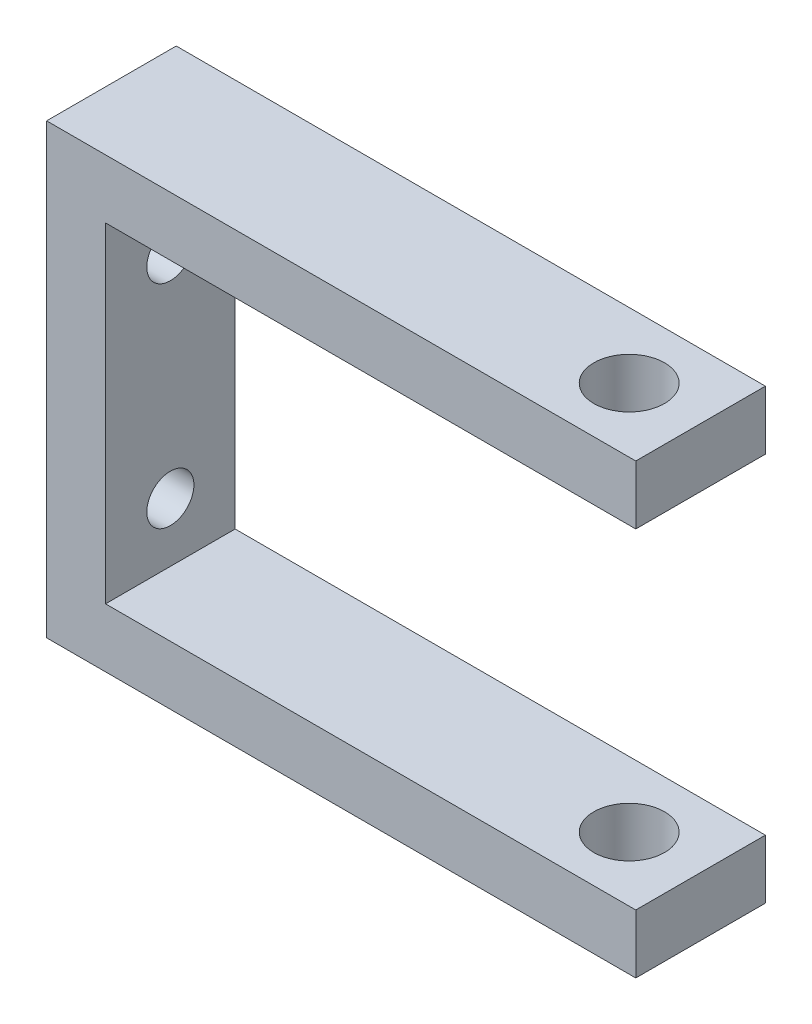
ISO-10303-21;
HEADER;
FILE_DESCRIPTION(('STEP AP214'),'2;1');
FILE_NAME('part.step','',(''),(''),'','','');
FILE_SCHEMA(('AUTOMOTIVE_DESIGN { 1 0 10303 214 1 1 1 1 }'));
ENDSEC;
DATA;
#1=APPLICATION_CONTEXT('core data for automotive mechanical design processes');
#2=APPLICATION_PROTOCOL_DEFINITION('international standard','automotive_design',2000,#1);
#3=PRODUCT_CONTEXT('',#1,'mechanical');
#4=PRODUCT('Part','Part','',(#3));
#5=PRODUCT_RELATED_PRODUCT_CATEGORY('part','',(#4));
#6=PRODUCT_DEFINITION_FORMATION('','',#4);
#7=PRODUCT_DEFINITION_CONTEXT('part definition',#1,'design');
#8=PRODUCT_DEFINITION('design','',#6,#7);
#9=PRODUCT_DEFINITION_SHAPE('','',#8);
#10=(LENGTH_UNIT() NAMED_UNIT(*) SI_UNIT(.MILLI.,.METRE.));
#11=(NAMED_UNIT(*) PLANE_ANGLE_UNIT() SI_UNIT($,.RADIAN.));
#12=(NAMED_UNIT(*) SI_UNIT($,.STERADIAN.) SOLID_ANGLE_UNIT());
#13=UNCERTAINTY_MEASURE_WITH_UNIT(LENGTH_MEASURE(1.E-05),#10,'distance_accuracy_value','');
#14=(GEOMETRIC_REPRESENTATION_CONTEXT(3) GLOBAL_UNCERTAINTY_ASSIGNED_CONTEXT((#13)) GLOBAL_UNIT_ASSIGNED_CONTEXT((#10,
#11,#12)) REPRESENTATION_CONTEXT('',''));
#15=CARTESIAN_POINT('',(0.,0.,0.));
#16=DIRECTION('',(0.,0.,1.));
#17=DIRECTION('',(1.,0.,0.));
#18=AXIS2_PLACEMENT_3D('',#15,#16,#17);
#19=CARTESIAN_POINT('',(0.,14.,11.));
#20=DIRECTION('',(-1.,0.,0.));
#21=DIRECTION('',(0.,-1.,0.));
#22=AXIS2_PLACEMENT_3D('',#19,#20,#21);
#23=PLANE('',#22);
#24=DIRECTION('',(0.,1.,0.));
#25=VECTOR('',#24,1.);
#26=CARTESIAN_POINT('',(0.,14.,0.));
#27=LINE('',#26,#25);
#28=CARTESIAN_POINT('',(0.,14.,0.));
#29=VERTEX_POINT('',#28);
#30=CARTESIAN_POINT('',(0.,19.,0.));
#31=VERTEX_POINT('',#30);
#32=EDGE_CURVE('E136',#29,#31,#27,.T.);
#33=ORIENTED_EDGE('',*,*,#32,.T.);
#34=DIRECTION('',(0.,0.,-1.));
#35=VECTOR('',#34,1.);
#36=CARTESIAN_POINT('',(0.,19.,11.));
#37=LINE('',#36,#35);
#38=CARTESIAN_POINT('',(0.,19.,11.));
#39=VERTEX_POINT('',#38);
#40=EDGE_CURVE('E11',#39,#31,#37,.T.);
#41=ORIENTED_EDGE('',*,*,#40,.F.);
#42=DIRECTION('',(0.,1.,0.));
#43=VECTOR('',#42,1.);
#44=CARTESIAN_POINT('',(0.,14.,11.));
#45=LINE('',#44,#43);
#46=CARTESIAN_POINT('',(0.,14.,11.));
#47=VERTEX_POINT('',#46);
#48=EDGE_CURVE('E151',#47,#39,#45,.T.);
#49=ORIENTED_EDGE('',*,*,#48,.F.);
#50=DIRECTION('',(0.,0.,-1.));
#51=VECTOR('',#50,1.);
#52=CARTESIAN_POINT('',(0.,14.,11.));
#53=LINE('',#52,#51);
#54=EDGE_CURVE('E135',#47,#29,#53,.T.);
#55=ORIENTED_EDGE('',*,*,#54,.T.);
#56=EDGE_LOOP('',(#33,#41,#49,#55));
#57=FACE_BOUND('',#56,.T.);
#58=ADVANCED_FACE('F39',(#57),#23,.F.);
#59=CARTESIAN_POINT('',(0.,19.,11.));
#60=DIRECTION('',(0.,-1.,0.));
#61=DIRECTION('',(1.,0.,0.));
#62=AXIS2_PLACEMENT_3D('',#59,#60,#61);
#63=PLANE('',#62);
#64=CARTESIAN_POINT('',(-6.,19.,5.55950177640294));
#65=DIRECTION('',(0.,1.,0.));
#66=DIRECTION('',(-1.,0.,0.));
#67=AXIS2_PLACEMENT_3D('',#64,#65,#66);
#68=CIRCLE('',#67,3.);
#69=CARTESIAN_POINT('',(-9.,19.,5.55950177640294));
#70=VERTEX_POINT('',#69);
#71=EDGE_CURVE('E189',#70,#70,#68,.T.);
#72=ORIENTED_EDGE('',*,*,#71,.F.);
#73=EDGE_LOOP('',(#72));
#74=FACE_BOUND('',#73,.T.);
#75=DIRECTION('',(-1.,0.,0.));
#76=VECTOR('',#75,1.);
#77=CARTESIAN_POINT('',(0.,19.,0.));
#78=LINE('',#77,#76);
#79=CARTESIAN_POINT('',(-50.,19.,0.));
#80=VERTEX_POINT('',#79);
#81=EDGE_CURVE('E138',#31,#80,#78,.T.);
#82=ORIENTED_EDGE('',*,*,#81,.T.);
#83=DIRECTION('',(0.,0.,-1.));
#84=VECTOR('',#83,1.);
#85=CARTESIAN_POINT('',(-50.,19.,11.));
#86=LINE('',#85,#84);
#87=CARTESIAN_POINT('',(-50.,19.,11.));
#88=VERTEX_POINT('',#87);
#89=EDGE_CURVE('E48',#88,#80,#86,.T.);
#90=ORIENTED_EDGE('',*,*,#89,.F.);
#91=DIRECTION('',(-1.,0.,0.));
#92=VECTOR('',#91,1.);
#93=CARTESIAN_POINT('',(0.,19.,11.));
#94=LINE('',#93,#92);
#95=EDGE_CURVE('E97',#39,#88,#94,.T.);
#96=ORIENTED_EDGE('',*,*,#95,.F.);
#97=ORIENTED_EDGE('',*,*,#40,.T.);
#98=EDGE_LOOP('',(#82,#90,#96,#97));
#99=FACE_BOUND('',#98,.T.);
#100=ADVANCED_FACE('F224',(#74,#99),#63,.F.);
#101=CARTESIAN_POINT('',(-50.,19.,11.));
#102=DIRECTION('',(1.,0.,0.));
#103=DIRECTION('',(0.,1.,0.));
#104=AXIS2_PLACEMENT_3D('',#101,#102,#103);
#105=PLANE('',#104);
#106=CARTESIAN_POINT('',(-50.,9.,5.5));
#107=DIRECTION('',(1.,0.,0.));
#108=DIRECTION('',(0.,1.,0.));
#109=AXIS2_PLACEMENT_3D('',#106,#107,#108);
#110=CIRCLE('',#109,2.);
#111=CARTESIAN_POINT('',(-50.,11.,5.5));
#112=VERTEX_POINT('',#111);
#113=EDGE_CURVE('E194',#112,#112,#110,.T.);
#114=ORIENTED_EDGE('',*,*,#113,.T.);
#115=EDGE_LOOP('',(#114));
#116=FACE_BOUND('',#115,.T.);
#117=CARTESIAN_POINT('',(-50.,-9.00000000000001,5.5));
#118=DIRECTION('',(1.,0.,0.));
#119=DIRECTION('',(0.,1.,0.));
#120=AXIS2_PLACEMENT_3D('',#117,#118,#119);
#121=CIRCLE('',#120,2.);
#122=CARTESIAN_POINT('',(-50.,-7.00000000000001,5.5));
#123=VERTEX_POINT('',#122);
#124=EDGE_CURVE('E198',#123,#123,#121,.T.);
#125=ORIENTED_EDGE('',*,*,#124,.T.);
#126=EDGE_LOOP('',(#125));
#127=FACE_BOUND('',#126,.T.);
#128=DIRECTION('',(0.,-1.,0.));
#129=VECTOR('',#128,1.);
#130=CARTESIAN_POINT('',(-50.,19.,0.));
#131=LINE('',#130,#129);
#132=CARTESIAN_POINT('',(-50.,-19.,0.));
#133=VERTEX_POINT('',#132);
#134=EDGE_CURVE('E142',#80,#133,#131,.T.);
#135=ORIENTED_EDGE('',*,*,#134,.T.);
#136=DIRECTION('',(0.,0.,-1.));
#137=VECTOR('',#136,1.);
#138=CARTESIAN_POINT('',(-50.,-19.,11.));
#139=LINE('',#138,#137);
#140=CARTESIAN_POINT('',(-50.,-19.,11.));
#141=VERTEX_POINT('',#140);
#142=EDGE_CURVE('E158',#141,#133,#139,.T.);
#143=ORIENTED_EDGE('',*,*,#142,.F.);
#144=DIRECTION('',(0.,-1.,0.));
#145=VECTOR('',#144,1.);
#146=CARTESIAN_POINT('',(-50.,19.,11.));
#147=LINE('',#146,#145);
#148=EDGE_CURVE('E170',#88,#141,#147,.T.);
#149=ORIENTED_EDGE('',*,*,#148,.F.);
#150=ORIENTED_EDGE('',*,*,#89,.T.);
#151=EDGE_LOOP('',(#135,#143,#149,#150));
#152=FACE_BOUND('',#151,.T.);
#153=ADVANCED_FACE('F164',(#116,#127,#152),#105,.F.);
#154=CARTESIAN_POINT('',(-50.,-19.,11.));
#155=DIRECTION('',(0.,1.,0.));
#156=DIRECTION('',(-1.,0.,0.));
#157=AXIS2_PLACEMENT_3D('',#154,#155,#156);
#158=PLANE('',#157);
#159=CARTESIAN_POINT('',(-5.99999999999999,-19.,5.55950177640294));
#160=DIRECTION('',(0.,1.,0.));
#161=DIRECTION('',(-1.,0.,0.));
#162=AXIS2_PLACEMENT_3D('',#159,#160,#161);
#163=CIRCLE('',#162,3.);
#164=CARTESIAN_POINT('',(-8.99999999999999,-19.,5.55950177640294));
#165=VERTEX_POINT('',#164);
#166=EDGE_CURVE('E140',#165,#165,#163,.T.);
#167=ORIENTED_EDGE('',*,*,#166,.T.);
#168=EDGE_LOOP('',(#167));
#169=FACE_BOUND('',#168,.T.);
#170=DIRECTION('',(1.,0.,0.));
#171=VECTOR('',#170,1.);
#172=CARTESIAN_POINT('',(-50.,-19.,0.));
#173=LINE('',#172,#171);
#174=CARTESIAN_POINT('',(0.,-19.,0.));
#175=VERTEX_POINT('',#174);
#176=EDGE_CURVE('E145',#133,#175,#173,.T.);
#177=ORIENTED_EDGE('',*,*,#176,.T.);
#178=DIRECTION('',(0.,0.,-1.));
#179=VECTOR('',#178,1.);
#180=CARTESIAN_POINT('',(0.,-19.,11.));
#181=LINE('',#180,#179);
#182=CARTESIAN_POINT('',(0.,-19.,11.));
#183=VERTEX_POINT('',#182);
#184=EDGE_CURVE('E154',#183,#175,#181,.T.);
#185=ORIENTED_EDGE('',*,*,#184,.F.);
#186=DIRECTION('',(1.,0.,0.));
#187=VECTOR('',#186,1.);
#188=CARTESIAN_POINT('',(-50.,-19.,11.));
#189=LINE('',#188,#187);
#190=EDGE_CURVE('E178',#141,#183,#189,.T.);
#191=ORIENTED_EDGE('',*,*,#190,.F.);
#192=ORIENTED_EDGE('',*,*,#142,.T.);
#193=EDGE_LOOP('',(#177,#185,#191,#192));
#194=FACE_BOUND('',#193,.T.);
#195=ADVANCED_FACE('F174',(#169,#194),#158,.F.);
#196=CARTESIAN_POINT('',(0.,-19.,11.));
#197=DIRECTION('',(-1.,0.,0.));
#198=DIRECTION('',(0.,-1.,0.));
#199=AXIS2_PLACEMENT_3D('',#196,#197,#198);
#200=PLANE('',#199);
#201=DIRECTION('',(0.,1.,0.));
#202=VECTOR('',#201,1.);
#203=CARTESIAN_POINT('',(0.,-19.,0.));
#204=LINE('',#203,#202);
#205=CARTESIAN_POINT('',(0.,-14.,0.));
#206=VERTEX_POINT('',#205);
#207=EDGE_CURVE('E148',#175,#206,#204,.T.);
#208=ORIENTED_EDGE('',*,*,#207,.T.);
#209=DIRECTION('',(0.,0.,-1.));
#210=VECTOR('',#209,1.);
#211=CARTESIAN_POINT('',(0.,-14.,11.));
#212=LINE('',#211,#210);
#213=CARTESIAN_POINT('',(0.,-14.,11.));
#214=VERTEX_POINT('',#213);
#215=EDGE_CURVE('E130',#214,#206,#212,.T.);
#216=ORIENTED_EDGE('',*,*,#215,.F.);
#217=DIRECTION('',(0.,1.,0.));
#218=VECTOR('',#217,1.);
#219=CARTESIAN_POINT('',(0.,-19.,11.));
#220=LINE('',#219,#218);
#221=EDGE_CURVE('E117',#183,#214,#220,.T.);
#222=ORIENTED_EDGE('',*,*,#221,.F.);
#223=ORIENTED_EDGE('',*,*,#184,.T.);
#224=EDGE_LOOP('',(#208,#216,#222,#223));
#225=FACE_BOUND('',#224,.T.);
#226=ADVANCED_FACE('F179',(#225),#200,.F.);
#227=CARTESIAN_POINT('',(0.,-14.,11.));
#228=DIRECTION('',(0.,-1.,0.));
#229=DIRECTION('',(1.,0.,0.));
#230=AXIS2_PLACEMENT_3D('',#227,#228,#229);
#231=PLANE('',#230);
#232=CARTESIAN_POINT('',(-5.99999999999999,-14.,5.55950177640294));
#233=DIRECTION('',(0.,-1.,0.));
#234=DIRECTION('',(1.,0.,0.));
#235=AXIS2_PLACEMENT_3D('',#232,#233,#234);
#236=CIRCLE('',#235,3.);
#237=CARTESIAN_POINT('',(-2.99999999999999,-14.,5.55950177640294));
#238=VERTEX_POINT('',#237);
#239=EDGE_CURVE('E190',#238,#238,#236,.T.);
#240=ORIENTED_EDGE('',*,*,#239,.T.);
#241=EDGE_LOOP('',(#240));
#242=FACE_BOUND('',#241,.T.);
#243=DIRECTION('',(-1.,0.,0.));
#244=VECTOR('',#243,1.);
#245=CARTESIAN_POINT('',(0.,-14.,0.));
#246=LINE('',#245,#244);
#247=CARTESIAN_POINT('',(-45.,-14.,0.));
#248=VERTEX_POINT('',#247);
#249=EDGE_CURVE('E127',#206,#248,#246,.T.);
#250=ORIENTED_EDGE('',*,*,#249,.T.);
#251=DIRECTION('',(0.,0.,-1.));
#252=VECTOR('',#251,1.);
#253=CARTESIAN_POINT('',(-45.,-14.,11.));
#254=LINE('',#253,#252);
#255=CARTESIAN_POINT('',(-45.,-14.,11.));
#256=VERTEX_POINT('',#255);
#257=EDGE_CURVE('E124',#256,#248,#254,.T.);
#258=ORIENTED_EDGE('',*,*,#257,.F.);
#259=DIRECTION('',(-1.,0.,0.));
#260=VECTOR('',#259,1.);
#261=CARTESIAN_POINT('',(0.,-14.,11.));
#262=LINE('',#261,#260);
#263=EDGE_CURVE('E115',#214,#256,#262,.T.);
#264=ORIENTED_EDGE('',*,*,#263,.F.);
#265=ORIENTED_EDGE('',*,*,#215,.T.);
#266=EDGE_LOOP('',(#250,#258,#264,#265));
#267=FACE_BOUND('',#266,.T.);
#268=ADVANCED_FACE('F123',(#242,#267),#231,.F.);
#269=CARTESIAN_POINT('',(-45.,-14.,11.));
#270=DIRECTION('',(-1.,0.,0.));
#271=DIRECTION('',(0.,0.,1.));
#272=AXIS2_PLACEMENT_3D('',#269,#270,#271);
#273=PLANE('',#272);
#274=CARTESIAN_POINT('',(-45.,9.,5.5));
#275=DIRECTION('',(1.,0.,0.));
#276=DIRECTION('',(0.,0.,-1.));
#277=AXIS2_PLACEMENT_3D('',#274,#275,#276);
#278=CIRCLE('',#277,2.);
#279=CARTESIAN_POINT('',(-45.,9.,3.5));
#280=VERTEX_POINT('',#279);
#281=EDGE_CURVE('E200',#280,#280,#278,.T.);
#282=ORIENTED_EDGE('',*,*,#281,.F.);
#283=EDGE_LOOP('',(#282));
#284=FACE_BOUND('',#283,.T.);
#285=CARTESIAN_POINT('',(-45.,-9.00000000000001,5.5));
#286=DIRECTION('',(1.,0.,0.));
#287=DIRECTION('',(0.,0.,-1.));
#288=AXIS2_PLACEMENT_3D('',#285,#286,#287);
#289=CIRCLE('',#288,2.);
#290=CARTESIAN_POINT('',(-45.,-9.00000000000001,3.5));
#291=VERTEX_POINT('',#290);
#292=EDGE_CURVE('E199',#291,#291,#289,.T.);
#293=ORIENTED_EDGE('',*,*,#292,.F.);
#294=EDGE_LOOP('',(#293));
#295=FACE_BOUND('',#294,.T.);
#296=DIRECTION('',(0.,1.,0.));
#297=VECTOR('',#296,1.);
#298=CARTESIAN_POINT('',(-45.,-14.,0.));
#299=LINE('',#298,#297);
#300=CARTESIAN_POINT('',(-45.,14.,0.));
#301=VERTEX_POINT('',#300);
#302=EDGE_CURVE('E85',#248,#301,#299,.T.);
#303=ORIENTED_EDGE('',*,*,#302,.T.);
#304=DIRECTION('',(0.,0.,-1.));
#305=VECTOR('',#304,1.);
#306=CARTESIAN_POINT('',(-45.,14.,11.));
#307=LINE('',#306,#305);
#308=CARTESIAN_POINT('',(-45.,14.,11.));
#309=VERTEX_POINT('',#308);
#310=EDGE_CURVE('E126',#309,#301,#307,.T.);
#311=ORIENTED_EDGE('',*,*,#310,.F.);
#312=DIRECTION('',(0.,1.,0.));
#313=VECTOR('',#312,1.);
#314=CARTESIAN_POINT('',(-45.,-14.,11.));
#315=LINE('',#314,#313);
#316=EDGE_CURVE('E116',#256,#309,#315,.T.);
#317=ORIENTED_EDGE('',*,*,#316,.F.);
#318=ORIENTED_EDGE('',*,*,#257,.T.);
#319=EDGE_LOOP('',(#303,#311,#317,#318));
#320=FACE_BOUND('',#319,.T.);
#321=ADVANCED_FACE('F128',(#284,#295,#320),#273,.F.);
#322=CARTESIAN_POINT('',(-45.,14.,11.));
#323=DIRECTION('',(0.,1.,0.));
#324=DIRECTION('',(0.,0.,1.));
#325=AXIS2_PLACEMENT_3D('',#322,#323,#324);
#326=PLANE('',#325);
#327=CARTESIAN_POINT('',(-6.,14.,5.55950177640294));
#328=DIRECTION('',(0.,1.,0.));
#329=DIRECTION('',(0.,0.,1.));
#330=AXIS2_PLACEMENT_3D('',#327,#328,#329);
#331=CIRCLE('',#330,3.);
#332=CARTESIAN_POINT('',(-6.,14.,8.55950177640294));
#333=VERTEX_POINT('',#332);
#334=EDGE_CURVE('E45',#333,#333,#331,.T.);
#335=ORIENTED_EDGE('',*,*,#334,.T.);
#336=EDGE_LOOP('',(#335));
#337=FACE_BOUND('',#336,.T.);
#338=DIRECTION('',(1.,0.,0.));
#339=VECTOR('',#338,1.);
#340=CARTESIAN_POINT('',(-45.,14.,0.));
#341=LINE('',#340,#339);
#342=EDGE_CURVE('E93',#301,#29,#341,.T.);
#343=ORIENTED_EDGE('',*,*,#342,.T.);
#344=ORIENTED_EDGE('',*,*,#54,.F.);
#345=DIRECTION('',(1.,0.,0.));
#346=VECTOR('',#345,1.);
#347=CARTESIAN_POINT('',(-45.,14.,11.));
#348=LINE('',#347,#346);
#349=EDGE_CURVE('E57',#309,#47,#348,.T.);
#350=ORIENTED_EDGE('',*,*,#349,.F.);
#351=ORIENTED_EDGE('',*,*,#310,.T.);
#352=EDGE_LOOP('',(#343,#344,#350,#351));
#353=FACE_BOUND('',#352,.T.);
#354=ADVANCED_FACE('F211',(#337,#353),#326,.F.);
#355=CARTESIAN_POINT('',(0.,0.,11.));
#356=DIRECTION('',(0.,0.,1.));
#357=DIRECTION('',(1.,0.,0.));
#358=AXIS2_PLACEMENT_3D('',#355,#356,#357);
#359=PLANE('',#358);
#360=ORIENTED_EDGE('',*,*,#48,.T.);
#361=ORIENTED_EDGE('',*,*,#95,.T.);
#362=ORIENTED_EDGE('',*,*,#148,.T.);
#363=ORIENTED_EDGE('',*,*,#190,.T.);
#364=ORIENTED_EDGE('',*,*,#221,.T.);
#365=ORIENTED_EDGE('',*,*,#263,.T.);
#366=ORIENTED_EDGE('',*,*,#316,.T.);
#367=ORIENTED_EDGE('',*,*,#349,.T.);
#368=EDGE_LOOP('',(#360,#361,#362,#363,#364,#365,#366,#367));
#369=FACE_BOUND('',#368,.T.);
#370=ADVANCED_FACE('F111',(#369),#359,.T.);
#371=CARTESIAN_POINT('',(0.,0.,0.));
#372=DIRECTION('',(0.,0.,1.));
#373=DIRECTION('',(1.,0.,0.));
#374=AXIS2_PLACEMENT_3D('',#371,#372,#373);
#375=PLANE('',#374);
#376=ORIENTED_EDGE('',*,*,#32,.F.);
#377=ORIENTED_EDGE('',*,*,#342,.F.);
#378=ORIENTED_EDGE('',*,*,#302,.F.);
#379=ORIENTED_EDGE('',*,*,#249,.F.);
#380=ORIENTED_EDGE('',*,*,#207,.F.);
#381=ORIENTED_EDGE('',*,*,#176,.F.);
#382=ORIENTED_EDGE('',*,*,#134,.F.);
#383=ORIENTED_EDGE('',*,*,#81,.F.);
#384=EDGE_LOOP('',(#376,#377,#378,#379,#380,#381,#382,#383));
#385=FACE_BOUND('',#384,.T.);
#386=ADVANCED_FACE('F171',(#385),#375,.F.);
#387=CARTESIAN_POINT('',(-5.99999999999999,-31.,5.55950177640294));
#388=DIRECTION('',(0.,1.,0.));
#389=DIRECTION('',(-1.,0.,0.));
#390=AXIS2_PLACEMENT_3D('',#387,#388,#389);
#391=CYLINDRICAL_SURFACE('',#390,3.);
#392=ORIENTED_EDGE('',*,*,#71,.T.);
#393=EDGE_LOOP('',(#392));
#394=FACE_BOUND('',#393,.T.);
#395=ORIENTED_EDGE('',*,*,#334,.F.);
#396=EDGE_LOOP('',(#395));
#397=FACE_BOUND('',#396,.T.);
#398=ADVANCED_FACE('F269',(#394,#397),#391,.F.);
#399=ORIENTED_EDGE('',*,*,#239,.F.);
#400=EDGE_LOOP('',(#399));
#401=FACE_BOUND('',#400,.T.);
#402=ORIENTED_EDGE('',*,*,#166,.F.);
#403=EDGE_LOOP('',(#402));
#404=FACE_BOUND('',#403,.T.);
#405=ADVANCED_FACE('F217',(#401,#404),#391,.F.);
#406=CARTESIAN_POINT('',(-55.,-9.00000000000001,5.5));
#407=DIRECTION('',(1.,0.,0.));
#408=DIRECTION('',(0.,0.,-1.));
#409=AXIS2_PLACEMENT_3D('',#406,#407,#408);
#410=CYLINDRICAL_SURFACE('',#409,2.);
#411=ORIENTED_EDGE('',*,*,#292,.T.);
#412=EDGE_LOOP('',(#411));
#413=FACE_BOUND('',#412,.T.);
#414=ORIENTED_EDGE('',*,*,#124,.F.);
#415=EDGE_LOOP('',(#414));
#416=FACE_BOUND('',#415,.T.);
#417=ADVANCED_FACE('F214',(#413,#416),#410,.F.);
#418=CARTESIAN_POINT('',(-55.,9.,5.5));
#419=DIRECTION('',(1.,0.,0.));
#420=DIRECTION('',(0.,0.,-1.));
#421=AXIS2_PLACEMENT_3D('',#418,#419,#420);
#422=CYLINDRICAL_SURFACE('',#421,2.);
#423=ORIENTED_EDGE('',*,*,#281,.T.);
#424=EDGE_LOOP('',(#423));
#425=FACE_BOUND('',#424,.T.);
#426=ORIENTED_EDGE('',*,*,#113,.F.);
#427=EDGE_LOOP('',(#426));
#428=FACE_BOUND('',#427,.T.);
#429=ADVANCED_FACE('F206',(#425,#428),#422,.F.);
#430=CLOSED_SHELL('',(#58,#100,#153,#195,#226,#268,#321,#354,#370,#386,#398,#405,#417,#429));
#431=MANIFOLD_SOLID_BREP('B2',#430);
#432=ADVANCED_BREP_SHAPE_REPRESENTATION('',(#18,#431),#14);
#433=SHAPE_DEFINITION_REPRESENTATION(#9,#432);
ENDSEC;
END-ISO-10303-21;
